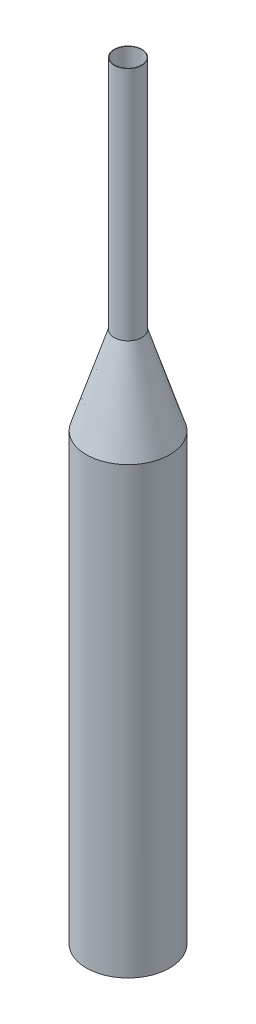
ISO-10303-21;
HEADER;
FILE_DESCRIPTION(('STEP AP214'),'2;1');
FILE_NAME('part.step','',(''),(''),'','','');
FILE_SCHEMA(('AUTOMOTIVE_DESIGN { 1 0 10303 214 1 1 1 1 }'));
ENDSEC;
DATA;
#1=APPLICATION_CONTEXT('core data for automotive mechanical design processes');
#2=APPLICATION_PROTOCOL_DEFINITION('international standard','automotive_design',2000,#1);
#3=PRODUCT_CONTEXT('',#1,'mechanical');
#4=PRODUCT('Part','Part','',(#3));
#5=PRODUCT_RELATED_PRODUCT_CATEGORY('part','',(#4));
#6=PRODUCT_DEFINITION_FORMATION('','',#4);
#7=PRODUCT_DEFINITION_CONTEXT('part definition',#1,'design');
#8=PRODUCT_DEFINITION('design','',#6,#7);
#9=PRODUCT_DEFINITION_SHAPE('','',#8);
#10=(LENGTH_UNIT() NAMED_UNIT(*) SI_UNIT(.MILLI.,.METRE.));
#11=(NAMED_UNIT(*) PLANE_ANGLE_UNIT() SI_UNIT($,.RADIAN.));
#12=(NAMED_UNIT(*) SI_UNIT($,.STERADIAN.) SOLID_ANGLE_UNIT());
#13=UNCERTAINTY_MEASURE_WITH_UNIT(LENGTH_MEASURE(1.E-05),#10,'distance_accuracy_value','');
#14=(GEOMETRIC_REPRESENTATION_CONTEXT(3) GLOBAL_UNCERTAINTY_ASSIGNED_CONTEXT((#13)) GLOBAL_UNIT_ASSIGNED_CONTEXT((#10,
#11,#12)) REPRESENTATION_CONTEXT('',''));
#15=CARTESIAN_POINT('',(0.,0.,0.));
#16=DIRECTION('',(0.,0.,1.));
#17=DIRECTION('',(1.,0.,0.));
#18=AXIS2_PLACEMENT_3D('',#15,#16,#17);
#19=CARTESIAN_POINT('',(0.,0.,0.));
#20=DIRECTION('',(0.,1.,0.));
#21=DIRECTION('',(0.,0.,1.));
#22=AXIS2_PLACEMENT_3D('',#19,#20,#21);
#23=PLANE('',#22);
#24=CARTESIAN_POINT('',(0.,0.,0.));
#25=DIRECTION('',(0.,1.,0.));
#26=DIRECTION('',(0.,0.,1.));
#27=AXIS2_PLACEMENT_3D('',#24,#25,#26);
#28=CIRCLE('',#27,314.325);
#29=CARTESIAN_POINT('',(0.,0.,314.325));
#30=VERTEX_POINT('',#29);
#31=EDGE_CURVE('E38',#30,#30,#28,.T.);
#32=ORIENTED_EDGE('',*,*,#31,.F.);
#33=EDGE_LOOP('',(#32));
#34=FACE_BOUND('',#33,.T.);
#35=CARTESIAN_POINT('',(0.,0.,0.));
#36=DIRECTION('',(0.,1.,0.));
#37=DIRECTION('',(0.,0.,1.));
#38=AXIS2_PLACEMENT_3D('',#35,#36,#37);
#39=CIRCLE('',#38,311.15);
#40=CARTESIAN_POINT('',(0.,0.,311.15));
#41=VERTEX_POINT('',#40);
#42=EDGE_CURVE('E45',#41,#41,#39,.T.);
#43=ORIENTED_EDGE('',*,*,#42,.T.);
#44=EDGE_LOOP('',(#43));
#45=FACE_BOUND('',#44,.T.);
#46=ADVANCED_FACE('F34',(#34,#45),#23,.F.);
#47=CARTESIAN_POINT('',(0.,3352.8,0.));
#48=DIRECTION('',(0.,-1.,0.));
#49=DIRECTION('',(0.,0.,-1.));
#50=AXIS2_PLACEMENT_3D('',#47,#48,#49);
#51=CYLINDRICAL_SURFACE('',#50,314.325);
#52=CARTESIAN_POINT('',(0.,3352.8,0.));
#53=DIRECTION('',(0.,1.,0.));
#54=DIRECTION('',(0.,0.,1.));
#55=AXIS2_PLACEMENT_3D('',#52,#53,#54);
#56=CIRCLE('',#55,314.325);
#57=CARTESIAN_POINT('',(0.,3352.8,-314.325));
#58=VERTEX_POINT('',#57);
#59=EDGE_CURVE('E10',#58,#58,#56,.T.);
#60=ORIENTED_EDGE('',*,*,#59,.F.);
#61=EDGE_LOOP('',(#60));
#62=FACE_BOUND('',#61,.T.);
#63=ORIENTED_EDGE('',*,*,#31,.T.);
#64=EDGE_LOOP('',(#63));
#65=FACE_BOUND('',#64,.T.);
#66=ADVANCED_FACE('F36',(#62,#65),#51,.T.);
#67=CARTESIAN_POINT('',(0.,3352.8,0.));
#68=DIRECTION('',(0.,-1.,0.));
#69=DIRECTION('',(0.,0.,-1.));
#70=AXIS2_PLACEMENT_3D('',#67,#68,#69);
#71=CYLINDRICAL_SURFACE('',#70,311.15);
#72=CARTESIAN_POINT('',(0.,3352.8,0.));
#73=DIRECTION('',(0.,-1.,0.));
#74=DIRECTION('',(0.,0.,-1.));
#75=AXIS2_PLACEMENT_3D('',#72,#73,#74);
#76=CIRCLE('',#75,311.15);
#77=CARTESIAN_POINT('',(0.,3352.8,-311.15));
#78=VERTEX_POINT('',#77);
#79=EDGE_CURVE('E61',#78,#78,#76,.T.);
#80=ORIENTED_EDGE('',*,*,#79,.F.);
#81=EDGE_LOOP('',(#80));
#82=FACE_BOUND('',#81,.T.);
#83=ORIENTED_EDGE('',*,*,#42,.F.);
#84=EDGE_LOOP('',(#83));
#85=FACE_BOUND('',#84,.T.);
#86=ADVANCED_FACE('F67',(#82,#85),#71,.F.);
#87=CARTESIAN_POINT('',(0.,4013.2,0.));
#88=DIRECTION('',(0.,-1.,0.));
#89=DIRECTION('',(0.,0.,-1.));
#90=AXIS2_PLACEMENT_3D('',#87,#88,#89);
#91=CONICAL_SURFACE('',#90,104.626105977152,0.307463638577645);
#92=CARTESIAN_POINT('',(0.,4013.2,0.));
#93=DIRECTION('',(0.,-1.,0.));
#94=DIRECTION('',(0.,0.,-1.));
#95=AXIS2_PLACEMENT_3D('',#92,#93,#94);
#96=CIRCLE('',#95,104.626105977152);
#97=CARTESIAN_POINT('',(0.,4013.2,-104.626105977152));
#98=VERTEX_POINT('',#97);
#99=EDGE_CURVE('E49',#98,#98,#96,.T.);
#100=CARTESIAN_POINT('',(0.,3352.8,-314.325));
#101=CARTESIAN_POINT('',(0.,3359.67916666667,-312.140636520595));
#102=CARTESIAN_POINT('',(0.,3366.55833333333,-309.956273041191));
#103=CARTESIAN_POINT('',(0.,3380.31666666667,-305.587546082381));
#104=CARTESIAN_POINT('',(0.,3387.19583333333,-303.403182602977));
#105=CARTESIAN_POINT('',(0.,3400.95416666667,-299.034455644167));
#106=CARTESIAN_POINT('',(0.,3407.83333333333,-296.850092164763));
#107=CARTESIAN_POINT('',(0.,3421.59166666667,-292.481365205953));
#108=CARTESIAN_POINT('',(0.,3428.47083333333,-290.297001726549));
#109=CARTESIAN_POINT('',(0.,3442.22916666667,-285.928274767739));
#110=CARTESIAN_POINT('',(0.,3449.10833333333,-283.743911288335));
#111=CARTESIAN_POINT('',(0.,3462.86666666667,-279.375184329525));
#112=CARTESIAN_POINT('',(0.,3469.74583333333,-277.190820850121));
#113=CARTESIAN_POINT('',(0.,3483.50416666667,-272.822093891311));
#114=CARTESIAN_POINT('',(0.,3490.38333333333,-270.637730411907));
#115=CARTESIAN_POINT('',(0.,3504.14166666667,-266.269003453097));
#116=CARTESIAN_POINT('',(0.,3511.02083333333,-264.084639973693));
#117=CARTESIAN_POINT('',(0.,3524.77916666667,-259.715913014883));
#118=CARTESIAN_POINT('',(0.,3531.65833333333,-257.531549535479));
#119=CARTESIAN_POINT('',(0.,3545.41666666667,-253.162822576669));
#120=CARTESIAN_POINT('',(0.,3552.29583333333,-250.978459097265));
#121=CARTESIAN_POINT('',(0.,3566.05416666667,-246.609732138455));
#122=CARTESIAN_POINT('',(0.,3572.93333333333,-244.425368659051));
#123=CARTESIAN_POINT('',(0.,3586.69166666667,-240.056641700241));
#124=CARTESIAN_POINT('',(0.,3593.57083333333,-237.872278220837));
#125=CARTESIAN_POINT('',(0.,3607.32916666667,-233.503551262027));
#126=CARTESIAN_POINT('',(0.,3614.20833333333,-231.319187782623));
#127=CARTESIAN_POINT('',(0.,3627.96666666667,-226.950460823813));
#128=CARTESIAN_POINT('',(0.,3634.84583333333,-224.766097344409));
#129=CARTESIAN_POINT('',(0.,3648.60416666667,-220.397370385599));
#130=CARTESIAN_POINT('',(0.,3655.48333333333,-218.213006906195));
#131=CARTESIAN_POINT('',(0.,3669.24166666667,-213.844279947385));
#132=CARTESIAN_POINT('',(0.,3676.12083333333,-211.659916467981));
#133=CARTESIAN_POINT('',(0.,3689.87916666667,-207.291189509171));
#134=CARTESIAN_POINT('',(0.,3696.75833333333,-205.106826029767));
#135=CARTESIAN_POINT('',(0.,3710.51666666667,-200.738099070957));
#136=CARTESIAN_POINT('',(0.,3717.39583333333,-198.553735591553));
#137=CARTESIAN_POINT('',(0.,3731.15416666667,-194.185008632743));
#138=CARTESIAN_POINT('',(0.,3738.03333333333,-192.000645153339));
#139=CARTESIAN_POINT('',(0.,3751.79166666667,-187.631918194529));
#140=CARTESIAN_POINT('',(0.,3758.67083333333,-185.447554715125));
#141=CARTESIAN_POINT('',(0.,3772.42916666667,-181.078827756315));
#142=CARTESIAN_POINT('',(0.,3779.30833333333,-178.894464276911));
#143=CARTESIAN_POINT('',(0.,3793.06666666667,-174.525737318101));
#144=CARTESIAN_POINT('',(0.,3799.94583333333,-172.341373838697));
#145=CARTESIAN_POINT('',(0.,3813.70416666667,-167.972646879887));
#146=CARTESIAN_POINT('',(0.,3820.58333333333,-165.788283400483));
#147=CARTESIAN_POINT('',(0.,3834.34166666667,-161.419556441673));
#148=CARTESIAN_POINT('',(0.,3841.22083333333,-159.235192962269));
#149=CARTESIAN_POINT('',(0.,3854.97916666667,-154.866466003459));
#150=CARTESIAN_POINT('',(0.,3861.85833333333,-152.682102524055));
#151=CARTESIAN_POINT('',(0.,3875.61666666667,-148.313375565245));
#152=CARTESIAN_POINT('',(0.,3882.49583333333,-146.129012085841));
#153=CARTESIAN_POINT('',(0.,3896.25416666667,-141.760285127031));
#154=CARTESIAN_POINT('',(0.,3903.13333333333,-139.575921647627));
#155=CARTESIAN_POINT('',(0.,3916.89166666667,-135.207194688817));
#156=CARTESIAN_POINT('',(0.,3923.77083333333,-133.022831209413));
#157=CARTESIAN_POINT('',(0.,3937.52916666667,-128.654104250603));
#158=CARTESIAN_POINT('',(0.,3944.40833333333,-126.469740771199));
#159=CARTESIAN_POINT('',(0.,3958.16666666667,-122.101013812389));
#160=CARTESIAN_POINT('',(0.,3965.04583333333,-119.916650332985));
#161=CARTESIAN_POINT('',(0.,3978.80416666667,-115.547923374175));
#162=CARTESIAN_POINT('',(0.,3985.68333333333,-113.363559894771));
#163=CARTESIAN_POINT('',(0.,3999.44166666667,-108.994832935961));
#164=CARTESIAN_POINT('',(0.,4006.32083333333,-106.810469456557));
#165=CARTESIAN_POINT('',(0.,4013.2,-104.626105977152));
#166=B_SPLINE_CURVE_WITH_KNOTS('',3,(#100,#101,#102,#103,#104,#105,#106,#107,#108,#109,#110,
#111,#112,#113,#114,#115,#116,#117,#118,#119,#120,#121,#122,#123,#124,#125,#126,#127,#128,#129,
#130,#131,#132,#133,#134,#135,#136,#137,#138,#139,#140,#141,#142,#143,#144,#145,#146,#147,#148,
#149,#150,#151,#152,#153,#154,#155,#156,#157,#158,#159,#160,#161,#162,#163,#164,#165),
.UNSPECIFIED.,.F.,.F.,(4,2,2,2,2,2,2,2,2,2,2,2,2,2,2,2,2,2,2,2,2,2,2,2,2,2,2,2,2,2,2,2,4),(0.,
21.652930530102,43.3058610602036,64.9587915903057,86.6117221204073,108.264652650509,
129.917583180611,151.570513710713,173.223444240815,194.876374770916,216.529305301018,
238.18223583112,259.835166361221,281.488096891323,303.141027421425,324.793957951527,
346.446888481629,368.09981901173,389.752749541832,411.405680071934,433.058610602035,
454.711541132137,476.364471662239,498.017402192341,519.670332722443,541.323263252544,
562.976193782646,584.629124312748,606.28205484285,627.934985372952,649.587915903053,
671.240846433155,692.893776963257),.UNSPECIFIED.);
#167=EDGE_CURVE('BSEAM70',#58,#98,#166,.T.);
#168=ORIENTED_EDGE('',*,*,#59,.T.);
#169=ORIENTED_EDGE('',*,*,#99,.T.);
#170=ORIENTED_EDGE('',*,*,#167,.T.);
#171=ORIENTED_EDGE('',*,*,#167,.F.);
#172=EDGE_LOOP('',(#168,#170,#169,#171));
#173=FACE_BOUND('',#172,.T.);
#174=ADVANCED_FACE('F70',(#173),#91,.T.);
#175=CARTESIAN_POINT('',(0.,3352.8,0.));
#176=DIRECTION('',(0.,-1.,0.));
#177=DIRECTION('',(0.,0.,-1.));
#178=AXIS2_PLACEMENT_3D('',#175,#176,#177);
#179=CYLINDRICAL_SURFACE('',#178,104.626105977152);
#180=ORIENTED_EDGE('',*,*,#99,.F.);
#181=EDGE_LOOP('',(#180));
#182=FACE_BOUND('',#181,.T.);
#183=CARTESIAN_POINT('',(0.,5791.2,0.));
#184=DIRECTION('',(0.,-1.,0.));
#185=DIRECTION('',(0.,0.,-1.));
#186=AXIS2_PLACEMENT_3D('',#183,#184,#185);
#187=CIRCLE('',#186,104.626105977152);
#188=CARTESIAN_POINT('',(0.,5791.2,-104.626105977152));
#189=VERTEX_POINT('',#188);
#190=EDGE_CURVE('E52',#189,#189,#187,.T.);
#191=ORIENTED_EDGE('',*,*,#190,.T.);
#192=EDGE_LOOP('',(#191));
#193=FACE_BOUND('',#192,.T.);
#194=ADVANCED_FACE('F84',(#182,#193),#179,.T.);
#195=CARTESIAN_POINT('',(-104.626105977152,5791.2,0.));
#196=DIRECTION('',(0.,-1.,0.));
#197=DIRECTION('',(0.,0.,-1.));
#198=AXIS2_PLACEMENT_3D('',#195,#196,#197);
#199=PLANE('',#198);
#200=ORIENTED_EDGE('',*,*,#190,.F.);
#201=EDGE_LOOP('',(#200));
#202=FACE_BOUND('',#201,.T.);
#203=CARTESIAN_POINT('',(0.,5791.2,0.));
#204=DIRECTION('',(0.,-1.,0.));
#205=DIRECTION('',(0.,0.,-1.));
#206=AXIS2_PLACEMENT_3D('',#203,#204,#205);
#207=CIRCLE('',#206,101.6);
#208=CARTESIAN_POINT('',(0.,5791.2,-101.6));
#209=VERTEX_POINT('',#208);
#210=EDGE_CURVE('E55',#209,#209,#207,.T.);
#211=ORIENTED_EDGE('',*,*,#210,.T.);
#212=EDGE_LOOP('',(#211));
#213=FACE_BOUND('',#212,.T.);
#214=ADVANCED_FACE('F87',(#202,#213),#199,.F.);
#215=CARTESIAN_POINT('',(0.,3352.8,0.));
#216=DIRECTION('',(0.,-1.,0.));
#217=DIRECTION('',(0.,0.,-1.));
#218=AXIS2_PLACEMENT_3D('',#215,#216,#217);
#219=CYLINDRICAL_SURFACE('',#218,101.6);
#220=ORIENTED_EDGE('',*,*,#210,.F.);
#221=EDGE_LOOP('',(#220));
#222=FACE_BOUND('',#221,.T.);
#223=CARTESIAN_POINT('',(0.,4012.73109141015,0.));
#224=DIRECTION('',(0.,-1.,0.));
#225=DIRECTION('',(0.,0.,-1.));
#226=AXIS2_PLACEMENT_3D('',#223,#224,#225);
#227=CIRCLE('',#226,101.6);
#228=CARTESIAN_POINT('',(0.,4012.73109141015,-101.6));
#229=VERTEX_POINT('',#228);
#230=EDGE_CURVE('E58',#229,#229,#227,.T.);
#231=ORIENTED_EDGE('',*,*,#230,.T.);
#232=EDGE_LOOP('',(#231));
#233=FACE_BOUND('',#232,.T.);
#234=ADVANCED_FACE('F91',(#222,#233),#219,.F.);
#235=CARTESIAN_POINT('',(0.,3352.8,0.));
#236=DIRECTION('',(0.,-1.,0.));
#237=DIRECTION('',(0.,0.,-1.));
#238=AXIS2_PLACEMENT_3D('',#235,#236,#237);
#239=CONICAL_SURFACE('',#238,311.15,0.307463638577645);
#240=CARTESIAN_POINT('',(0.,4012.73109141015,-101.6));
#241=CARTESIAN_POINT('',(0.,4005.85680920796,-103.7828125));
#242=CARTESIAN_POINT('',(0.,3998.98252700577,-105.965625));
#243=CARTESIAN_POINT('',(0.,3985.2339626014,-110.33125));
#244=CARTESIAN_POINT('',(0.,3978.35968039921,-112.5140625));
#245=CARTESIAN_POINT('',(0.,3964.61111599483,-116.8796875));
#246=CARTESIAN_POINT('',(0.,3957.73683379264,-119.0625));
#247=CARTESIAN_POINT('',(0.,3943.98826938826,-123.428125));
#248=CARTESIAN_POINT('',(0.,3937.11398718607,-125.6109375));
#249=CARTESIAN_POINT('',(0.,3923.36542278169,-129.9765625));
#250=CARTESIAN_POINT('',(0.,3916.49114057951,-132.159375));
#251=CARTESIAN_POINT('',(0.,3902.74257617513,-136.525));
#252=CARTESIAN_POINT('',(0.,3895.86829397294,-138.7078125));
#253=CARTESIAN_POINT('',(0.,3882.11972956856,-143.0734375));
#254=CARTESIAN_POINT('',(0.,3875.24544736637,-145.25625));
#255=CARTESIAN_POINT('',(0.,3861.49688296199,-149.621875));
#256=CARTESIAN_POINT('',(0.,3854.6226007598,-151.8046875));
#257=CARTESIAN_POINT('',(0.,3840.87403635543,-156.1703125));
#258=CARTESIAN_POINT('',(0.,3833.99975415324,-158.353125));
#259=CARTESIAN_POINT('',(0.,3820.25118974886,-162.71875));
#260=CARTESIAN_POINT('',(0.,3813.37690754667,-164.9015625));
#261=CARTESIAN_POINT('',(0.,3799.62834314229,-169.2671875));
#262=CARTESIAN_POINT('',(0.,3792.7540609401,-171.45));
#263=CARTESIAN_POINT('',(0.,3779.00549653572,-175.815625));
#264=CARTESIAN_POINT('',(0.,3772.13121433353,-177.9984375));
#265=CARTESIAN_POINT('',(0.,3758.38264992916,-182.3640625));
#266=CARTESIAN_POINT('',(0.,3751.50836772697,-184.546875));
#267=CARTESIAN_POINT('',(0.,3737.75980332259,-188.9125));
#268=CARTESIAN_POINT('',(0.,3730.8855211204,-191.0953125));
#269=CARTESIAN_POINT('',(0.,3717.13695671602,-195.4609375));
#270=CARTESIAN_POINT('',(0.,3710.26267451383,-197.64375));
#271=CARTESIAN_POINT('',(0.,3696.51411010945,-202.009375));
#272=CARTESIAN_POINT('',(0.,3689.63982790727,-204.1921875));
#273=CARTESIAN_POINT('',(0.,3675.89126350289,-208.5578125));
#274=CARTESIAN_POINT('',(0.,3669.0169813007,-210.740625));
#275=CARTESIAN_POINT('',(0.,3655.26841689632,-215.10625));
#276=CARTESIAN_POINT('',(0.,3648.39413469413,-217.2890625));
#277=CARTESIAN_POINT('',(0.,3634.64557028975,-221.6546875));
#278=CARTESIAN_POINT('',(0.,3627.77128808756,-223.8375));
#279=CARTESIAN_POINT('',(0.,3614.02272368319,-228.203125));
#280=CARTESIAN_POINT('',(0.,3607.148441481,-230.3859375));
#281=CARTESIAN_POINT('',(0.,3593.39987707662,-234.7515625));
#282=CARTESIAN_POINT('',(0.,3586.52559487443,-236.934375));
#283=CARTESIAN_POINT('',(0.,3572.77703047005,-241.3));
#284=CARTESIAN_POINT('',(0.,3565.90274826786,-243.4828125));
#285=CARTESIAN_POINT('',(0.,3552.15418386348,-247.8484375));
#286=CARTESIAN_POINT('',(0.,3545.27990166129,-250.03125));
#287=CARTESIAN_POINT('',(0.,3531.53133725692,-254.396875));
#288=CARTESIAN_POINT('',(0.,3524.65705505473,-256.5796875));
#289=CARTESIAN_POINT('',(0.,3510.90849065035,-260.9453125));
#290=CARTESIAN_POINT('',(0.,3504.03420844816,-263.128125));
#291=CARTESIAN_POINT('',(0.,3490.28564404378,-267.49375));
#292=CARTESIAN_POINT('',(0.,3483.41136184159,-269.6765625));
#293=CARTESIAN_POINT('',(0.,3469.66279743721,-274.0421875));
#294=CARTESIAN_POINT('',(0.,3462.78851523503,-276.225));
#295=CARTESIAN_POINT('',(0.,3449.03995083065,-280.590625));
#296=CARTESIAN_POINT('',(0.,3442.16566862846,-282.7734375));
#297=CARTESIAN_POINT('',(0.,3428.41710422408,-287.1390625));
#298=CARTESIAN_POINT('',(0.,3421.54282202189,-289.321875));
#299=CARTESIAN_POINT('',(0.,3407.79425761751,-293.6875));
#300=CARTESIAN_POINT('',(0.,3400.91997541532,-295.8703125));
#301=CARTESIAN_POINT('',(0.,3387.17141101095,-300.2359375));
#302=CARTESIAN_POINT('',(0.,3380.29712880876,-302.41875));
#303=CARTESIAN_POINT('',(0.,3366.54856440438,-306.784375));
#304=CARTESIAN_POINT('',(0.,3359.67428220219,-308.9671875));
#305=CARTESIAN_POINT('',(0.,3352.8,-311.15));
#306=B_SPLINE_CURVE_WITH_KNOTS('',3,(#240,#241,#242,#243,#244,#245,#246,#247,#248,#249,#250,
#251,#252,#253,#254,#255,#256,#257,#258,#259,#260,#261,#262,#263,#264,#265,#266,#267,#268,#269,
#270,#271,#272,#273,#274,#275,#276,#277,#278,#279,#280,#281,#282,#283,#284,#285,#286,#287,#288,
#289,#290,#291,#292,#293,#294,#295,#296,#297,#298,#299,#300,#301,#302,#303,#304,#305),
.UNSPECIFIED.,.F.,.F.,(4,2,2,2,2,2,2,2,2,2,2,2,2,2,2,2,2,2,2,2,2,2,2,2,2,2,2,2,2,2,2,2,4),(0.,
21.6375561431835,43.2751122863669,64.9126684295504,86.5502245727338,108.187780715917,
129.8253368591,151.462893002283,173.100449145467,194.73800528865,216.375561431833,
238.013117575017,259.6506737182,281.288229861383,302.925786004567,324.56334214775,
346.200898290933,367.838454434116,389.4760105773,411.113566720483,432.751122863666,
454.38867900685,476.026235150033,497.663791293216,519.3013474364,540.938903579583,
562.576459722766,584.214015865949,605.851572009133,627.489128152316,649.126684295499,
670.764240438683,692.401796581866),.UNSPECIFIED.);
#307=EDGE_CURVE('BSEAM65',#229,#78,#306,.T.);
#308=ORIENTED_EDGE('',*,*,#230,.F.);
#309=ORIENTED_EDGE('',*,*,#79,.T.);
#310=ORIENTED_EDGE('',*,*,#307,.T.);
#311=ORIENTED_EDGE('',*,*,#307,.F.);
#312=EDGE_LOOP('',(#308,#310,#309,#311));
#313=FACE_BOUND('',#312,.T.);
#314=ADVANCED_FACE('F65',(#313),#239,.F.);
#315=CLOSED_SHELL('',(#46,#66,#86,#174,#194,#214,#234,#314));
#316=MANIFOLD_SOLID_BREP('B2',#315);
#317=ADVANCED_BREP_SHAPE_REPRESENTATION('',(#18,#316),#14);
#318=SHAPE_DEFINITION_REPRESENTATION(#9,#317);
ENDSEC;
END-ISO-10303-21;
